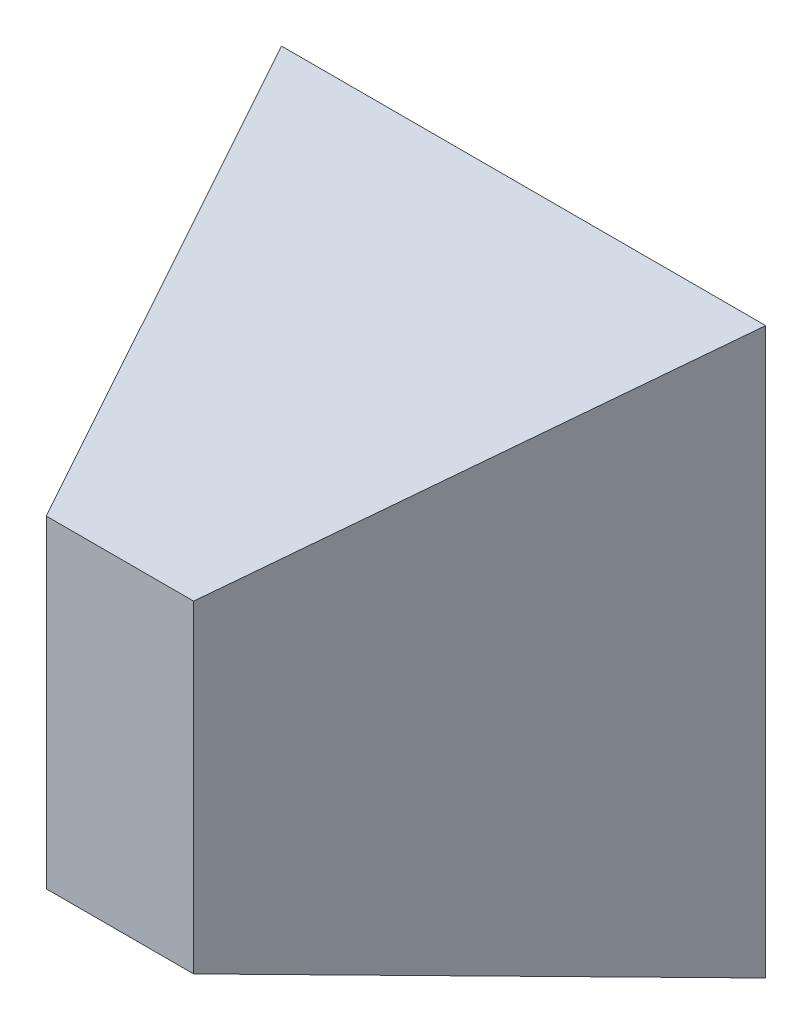
ISO-10303-21;
HEADER;
FILE_DESCRIPTION(('STEP AP214'),'2;1');
FILE_NAME('part.step','',(''),(''),'','','');
FILE_SCHEMA(('AUTOMOTIVE_DESIGN { 1 0 10303 214 1 1 1 1 }'));
ENDSEC;
DATA;
#1=APPLICATION_CONTEXT('core data for automotive mechanical design processes');
#2=APPLICATION_PROTOCOL_DEFINITION('international standard','automotive_design',2000,#1);
#3=PRODUCT_CONTEXT('',#1,'mechanical');
#4=PRODUCT('Part','Part','',(#3));
#5=PRODUCT_RELATED_PRODUCT_CATEGORY('part','',(#4));
#6=PRODUCT_DEFINITION_FORMATION('','',#4);
#7=PRODUCT_DEFINITION_CONTEXT('part definition',#1,'design');
#8=PRODUCT_DEFINITION('design','',#6,#7);
#9=PRODUCT_DEFINITION_SHAPE('','',#8);
#10=(LENGTH_UNIT() NAMED_UNIT(*) SI_UNIT(.MILLI.,.METRE.));
#11=(NAMED_UNIT(*) PLANE_ANGLE_UNIT() SI_UNIT($,.RADIAN.));
#12=(NAMED_UNIT(*) SI_UNIT($,.STERADIAN.) SOLID_ANGLE_UNIT());
#13=UNCERTAINTY_MEASURE_WITH_UNIT(LENGTH_MEASURE(1.E-05),#10,'distance_accuracy_value','');
#14=(GEOMETRIC_REPRESENTATION_CONTEXT(3) GLOBAL_UNCERTAINTY_ASSIGNED_CONTEXT((#13)) GLOBAL_UNIT_ASSIGNED_CONTEXT((#10,
#11,#12)) REPRESENTATION_CONTEXT('',''));
#15=CARTESIAN_POINT('',(0.,0.,0.));
#16=DIRECTION('',(0.,0.,1.));
#17=DIRECTION('',(1.,0.,0.));
#18=AXIS2_PLACEMENT_3D('',#15,#16,#17);
#19=CARTESIAN_POINT('',(0.,0.,0.));
#20=DIRECTION('',(0.,0.,-1.));
#21=DIRECTION('',(-1.,0.,0.));
#22=AXIS2_PLACEMENT_3D('',#19,#20,#21);
#23=PLANE('',#22);
#24=DIRECTION('',(0.,1.,0.));
#25=VECTOR('',#24,1.);
#26=CARTESIAN_POINT('',(152.4,-177.8,0.));
#27=LINE('',#26,#25);
#28=CARTESIAN_POINT('',(152.4,-177.8,0.));
#29=VERTEX_POINT('',#28);
#30=CARTESIAN_POINT('',(152.4,177.8,0.));
#31=VERTEX_POINT('',#30);
#32=EDGE_CURVE('E105',#29,#31,#27,.T.);
#33=ORIENTED_EDGE('',*,*,#32,.F.);
#34=DIRECTION('',(1.,0.,0.));
#35=VECTOR('',#34,1.);
#36=CARTESIAN_POINT('',(-152.4,-177.8,0.));
#37=LINE('',#36,#35);
#38=CARTESIAN_POINT('',(-152.4,-177.8,0.));
#39=VERTEX_POINT('',#38);
#40=EDGE_CURVE('E12',#39,#29,#37,.T.);
#41=ORIENTED_EDGE('',*,*,#40,.F.);
#42=DIRECTION('',(0.,-1.,0.));
#43=VECTOR('',#42,1.);
#44=CARTESIAN_POINT('',(-152.4,-177.8,0.));
#45=LINE('',#44,#43);
#46=CARTESIAN_POINT('',(-152.4,177.8,0.));
#47=VERTEX_POINT('',#46);
#48=EDGE_CURVE('E60',#47,#39,#45,.T.);
#49=ORIENTED_EDGE('',*,*,#48,.F.);
#50=DIRECTION('',(-1.,0.,0.));
#51=VECTOR('',#50,1.);
#52=CARTESIAN_POINT('',(-152.4,177.8,0.));
#53=LINE('',#52,#51);
#54=EDGE_CURVE('E193',#31,#47,#53,.T.);
#55=ORIENTED_EDGE('',*,*,#54,.F.);
#56=EDGE_LOOP('',(#33,#41,#49,#55));
#57=FACE_BOUND('',#56,.T.);
#58=ADVANCED_FACE('F49',(#57),#23,.T.);
#59=CARTESIAN_POINT('',(0.,0.,254.));
#60=DIRECTION('',(0.,0.,-1.));
#61=DIRECTION('',(-1.,0.,0.));
#62=AXIS2_PLACEMENT_3D('',#59,#60,#61);
#63=PLANE('',#62);
#64=DIRECTION('',(0.,1.,0.));
#65=VECTOR('',#64,1.);
#66=CARTESIAN_POINT('',(46.355,-101.6,254.));
#67=LINE('',#66,#65);
#68=CARTESIAN_POINT('',(46.355,-101.6,254.));
#69=VERTEX_POINT('',#68);
#70=CARTESIAN_POINT('',(46.355,101.6,254.));
#71=VERTEX_POINT('',#70);
#72=EDGE_CURVE('E162',#69,#71,#67,.T.);
#73=ORIENTED_EDGE('',*,*,#72,.T.);
#74=DIRECTION('',(-1.,0.,0.));
#75=VECTOR('',#74,1.);
#76=CARTESIAN_POINT('',(-46.355,101.6,254.));
#77=LINE('',#76,#75);
#78=CARTESIAN_POINT('',(-46.355,101.6,254.));
#79=VERTEX_POINT('',#78);
#80=EDGE_CURVE('E120',#71,#79,#77,.T.);
#81=ORIENTED_EDGE('',*,*,#80,.T.);
#82=DIRECTION('',(0.,-1.,0.));
#83=VECTOR('',#82,1.);
#84=CARTESIAN_POINT('',(-46.355,-101.6,254.));
#85=LINE('',#84,#83);
#86=CARTESIAN_POINT('',(-46.355,-101.6,254.));
#87=VERTEX_POINT('',#86);
#88=EDGE_CURVE('E99',#79,#87,#85,.T.);
#89=ORIENTED_EDGE('',*,*,#88,.T.);
#90=DIRECTION('',(1.,0.,0.));
#91=VECTOR('',#90,1.);
#92=CARTESIAN_POINT('',(-46.355,-101.6,254.));
#93=LINE('',#92,#91);
#94=EDGE_CURVE('E107',#87,#69,#93,.T.);
#95=ORIENTED_EDGE('',*,*,#94,.T.);
#96=EDGE_LOOP('',(#73,#81,#89,#95));
#97=FACE_BOUND('',#96,.T.);
#98=ADVANCED_FACE('F119',(#97),#63,.F.);
#99=CARTESIAN_POINT('',(0.,163.119266055046,48.9357798165137));
#100=DIRECTION('',(0.,0.957826285221151,0.287347885566345));
#101=DIRECTION('',(0.,-0.287347885566345,0.957826285221151));
#102=AXIS2_PLACEMENT_3D('',#99,#100,#101);
#103=PLANE('',#102);
#104=DIRECTION('',(0.371304606644695,0.266805705373433,-0.889352351244777));
#105=VECTOR('',#104,1.);
#106=CARTESIAN_POINT('',(46.355,101.6,254.));
#107=LINE('',#106,#105);
#108=EDGE_CURVE('E114',#71,#31,#107,.T.);
#109=ORIENTED_EDGE('',*,*,#108,.T.);
#110=ORIENTED_EDGE('',*,*,#54,.T.);
#111=DIRECTION('',(-0.371304606644694,0.266805705373433,-0.889352351244777));
#112=VECTOR('',#111,1.);
#113=CARTESIAN_POINT('',(-46.355,101.6,254.));
#114=LINE('',#113,#112);
#115=EDGE_CURVE('E205',#79,#47,#114,.T.);
#116=ORIENTED_EDGE('',*,*,#115,.F.);
#117=ORIENTED_EDGE('',*,*,#80,.F.);
#118=EDGE_LOOP('',(#109,#110,#116,#117));
#119=FACE_BOUND('',#118,.T.);
#120=ADVANCED_FACE('F140',(#119),#103,.T.);
#121=CARTESIAN_POINT('',(-129.778752348461,0.,54.1826291054825));
#122=DIRECTION('',(-0.922803671676548,0.,0.385270532924959));
#123=DIRECTION('',(0.385270532924959,0.,0.922803671676548));
#124=AXIS2_PLACEMENT_3D('',#121,#122,#123);
#125=PLANE('',#124);
#126=ORIENTED_EDGE('',*,*,#115,.T.);
#127=ORIENTED_EDGE('',*,*,#48,.T.);
#128=DIRECTION('',(-0.371304606644695,-0.266805705373433,-0.889352351244777));
#129=VECTOR('',#128,1.);
#130=CARTESIAN_POINT('',(-46.355,-101.6,254.));
#131=LINE('',#130,#129);
#132=EDGE_CURVE('E94',#87,#39,#131,.T.);
#133=ORIENTED_EDGE('',*,*,#132,.F.);
#134=ORIENTED_EDGE('',*,*,#88,.F.);
#135=EDGE_LOOP('',(#126,#127,#133,#134));
#136=FACE_BOUND('',#135,.T.);
#137=ADVANCED_FACE('F97',(#136),#125,.T.);
#138=CARTESIAN_POINT('',(129.778752348461,0.,54.1826291054825));
#139=DIRECTION('',(0.922803671676548,0.,0.385270532924959));
#140=DIRECTION('',(0.385270532924959,0.,-0.922803671676548));
#141=AXIS2_PLACEMENT_3D('',#138,#139,#140);
#142=PLANE('',#141);
#143=DIRECTION('',(0.371304606644695,-0.266805705373433,-0.889352351244777));
#144=VECTOR('',#143,1.);
#145=CARTESIAN_POINT('',(46.355,-101.6,254.));
#146=LINE('',#145,#144);
#147=EDGE_CURVE('E68',#69,#29,#146,.T.);
#148=ORIENTED_EDGE('',*,*,#147,.T.);
#149=ORIENTED_EDGE('',*,*,#32,.T.);
#150=ORIENTED_EDGE('',*,*,#108,.F.);
#151=ORIENTED_EDGE('',*,*,#72,.F.);
#152=EDGE_LOOP('',(#148,#149,#150,#151));
#153=FACE_BOUND('',#152,.T.);
#154=ADVANCED_FACE('F226',(#153),#142,.T.);
#155=CARTESIAN_POINT('',(0.,-163.119266055046,48.9357798165137));
#156=DIRECTION('',(0.,-0.957826285221151,0.287347885566345));
#157=DIRECTION('',(0.,-0.287347885566345,-0.957826285221151));
#158=AXIS2_PLACEMENT_3D('',#155,#156,#157);
#159=PLANE('',#158);
#160=ORIENTED_EDGE('',*,*,#132,.T.);
#161=ORIENTED_EDGE('',*,*,#40,.T.);
#162=ORIENTED_EDGE('',*,*,#147,.F.);
#163=ORIENTED_EDGE('',*,*,#94,.F.);
#164=EDGE_LOOP('',(#160,#161,#162,#163));
#165=FACE_BOUND('',#164,.T.);
#166=ADVANCED_FACE('F109',(#165),#159,.T.);
#167=CLOSED_SHELL('',(#58,#98,#120,#137,#154,#166));
#168=MANIFOLD_SOLID_BREP('B2',#167);
#169=ADVANCED_BREP_SHAPE_REPRESENTATION('',(#18,#168),#14);
#170=SHAPE_DEFINITION_REPRESENTATION(#9,#169);
ENDSEC;
END-ISO-10303-21;
